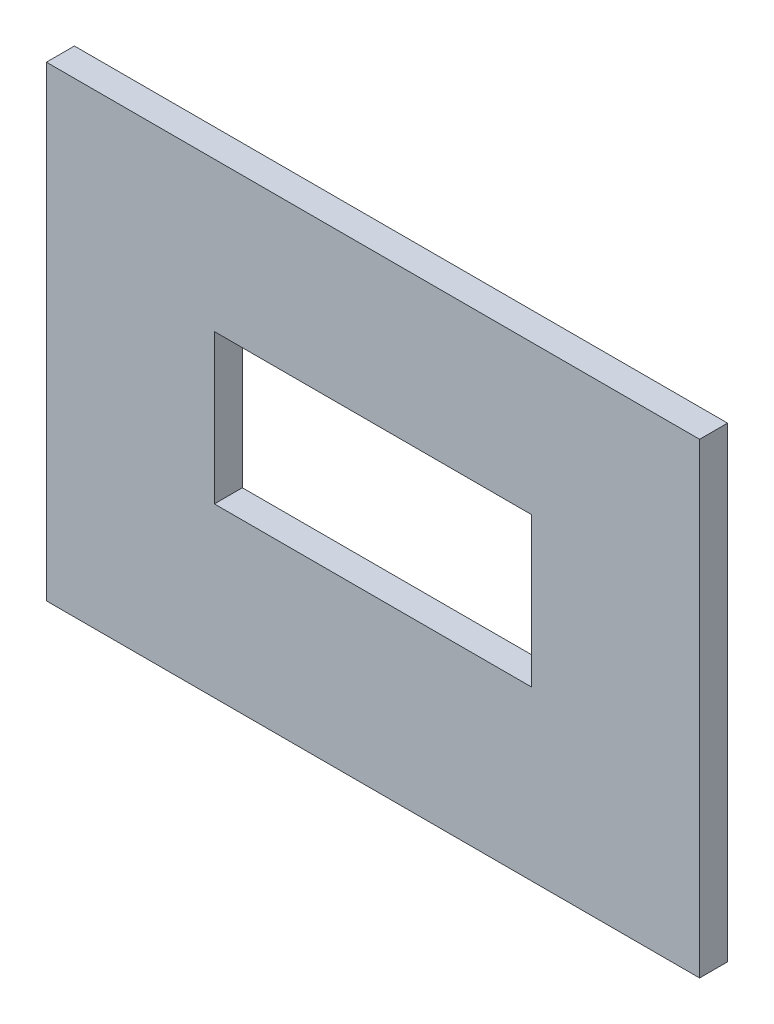
ISO-10303-21;
HEADER;
FILE_DESCRIPTION(('STEP AP214'),'2;1');
FILE_NAME('part.step','',(''),(''),'','','');
FILE_SCHEMA(('AUTOMOTIVE_DESIGN { 1 0 10303 214 1 1 1 1 }'));
ENDSEC;
DATA;
#1=APPLICATION_CONTEXT('core data for automotive mechanical design processes');
#2=APPLICATION_PROTOCOL_DEFINITION('international standard','automotive_design',2000,#1);
#3=PRODUCT_CONTEXT('',#1,'mechanical');
#4=PRODUCT('Part','Part','',(#3));
#5=PRODUCT_RELATED_PRODUCT_CATEGORY('part','',(#4));
#6=PRODUCT_DEFINITION_FORMATION('','',#4);
#7=PRODUCT_DEFINITION_CONTEXT('part definition',#1,'design');
#8=PRODUCT_DEFINITION('design','',#6,#7);
#9=PRODUCT_DEFINITION_SHAPE('','',#8);
#10=(LENGTH_UNIT() NAMED_UNIT(*) SI_UNIT(.MILLI.,.METRE.));
#11=(NAMED_UNIT(*) PLANE_ANGLE_UNIT() SI_UNIT($,.RADIAN.));
#12=(NAMED_UNIT(*) SI_UNIT($,.STERADIAN.) SOLID_ANGLE_UNIT());
#13=UNCERTAINTY_MEASURE_WITH_UNIT(LENGTH_MEASURE(1.E-05),#10,'distance_accuracy_value','');
#14=(GEOMETRIC_REPRESENTATION_CONTEXT(3) GLOBAL_UNCERTAINTY_ASSIGNED_CONTEXT((#13)) GLOBAL_UNIT_ASSIGNED_CONTEXT((#10,
#11,#12)) REPRESENTATION_CONTEXT('',''));
#15=CARTESIAN_POINT('',(0.,0.,0.));
#16=DIRECTION('',(0.,0.,1.));
#17=DIRECTION('',(1.,0.,0.));
#18=AXIS2_PLACEMENT_3D('',#15,#16,#17);
#19=CARTESIAN_POINT('',(0.,0.,3.));
#20=DIRECTION('',(0.,0.,-1.));
#21=DIRECTION('',(-1.,0.,0.));
#22=AXIS2_PLACEMENT_3D('',#19,#20,#21);
#23=PLANE('',#22);
#24=DIRECTION('',(1.,0.,0.));
#25=VECTOR('',#24,1.);
#26=CARTESIAN_POINT('',(16.,0.,3.));
#27=LINE('',#26,#25);
#28=CARTESIAN_POINT('',(0.,0.,3.));
#29=VERTEX_POINT('',#28);
#30=CARTESIAN_POINT('',(70.,0.,3.));
#31=VERTEX_POINT('',#30);
#32=EDGE_CURVE('E135',#29,#31,#27,.T.);
#33=ORIENTED_EDGE('',*,*,#32,.T.);
#34=DIRECTION('',(0.,1.,0.));
#35=VECTOR('',#34,1.);
#36=CARTESIAN_POINT('',(70.,50.,3.));
#37=LINE('',#36,#35);
#38=CARTESIAN_POINT('',(70.,50.,3.));
#39=VERTEX_POINT('',#38);
#40=EDGE_CURVE('E137',#31,#39,#37,.T.);
#41=ORIENTED_EDGE('',*,*,#40,.T.);
#42=DIRECTION('',(-1.,0.,0.));
#43=VECTOR('',#42,1.);
#44=CARTESIAN_POINT('',(0.,50.,3.));
#45=LINE('',#44,#43);
#46=CARTESIAN_POINT('',(0.,50.,3.));
#47=VERTEX_POINT('',#46);
#48=EDGE_CURVE('E140',#39,#47,#45,.T.);
#49=ORIENTED_EDGE('',*,*,#48,.T.);
#50=DIRECTION('',(0.,-1.,0.));
#51=VECTOR('',#50,1.);
#52=CARTESIAN_POINT('',(0.,0.,3.));
#53=LINE('',#52,#51);
#54=EDGE_CURVE('E142',#47,#29,#53,.T.);
#55=ORIENTED_EDGE('',*,*,#54,.T.);
#56=EDGE_LOOP('',(#33,#41,#49,#55));
#57=FACE_BOUND('',#56,.T.);
#58=DIRECTION('',(0.,-1.,0.));
#59=VECTOR('',#58,1.);
#60=CARTESIAN_POINT('',(18.,18.,3.));
#61=LINE('',#60,#59);
#62=CARTESIAN_POINT('',(18.,34.,3.));
#63=VERTEX_POINT('',#62);
#64=CARTESIAN_POINT('',(18.,18.,3.));
#65=VERTEX_POINT('',#64);
#66=EDGE_CURVE('E99',#63,#65,#61,.T.);
#67=ORIENTED_EDGE('',*,*,#66,.F.);
#68=DIRECTION('',(-1.,0.,0.));
#69=VECTOR('',#68,1.);
#70=CARTESIAN_POINT('',(52.,34.,3.));
#71=LINE('',#70,#69);
#72=CARTESIAN_POINT('',(52.,34.,3.));
#73=VERTEX_POINT('',#72);
#74=EDGE_CURVE('E121',#73,#63,#71,.T.);
#75=ORIENTED_EDGE('',*,*,#74,.F.);
#76=DIRECTION('',(0.,1.,0.));
#77=VECTOR('',#76,1.);
#78=CARTESIAN_POINT('',(52.,34.,3.));
#79=LINE('',#78,#77);
#80=CARTESIAN_POINT('',(52.,18.,3.));
#81=VERTEX_POINT('',#80);
#82=EDGE_CURVE('E119',#81,#73,#79,.T.);
#83=ORIENTED_EDGE('',*,*,#82,.F.);
#84=DIRECTION('',(1.,0.,0.));
#85=VECTOR('',#84,1.);
#86=CARTESIAN_POINT('',(18.,18.,3.));
#87=LINE('',#86,#85);
#88=EDGE_CURVE('E107',#65,#81,#87,.T.);
#89=ORIENTED_EDGE('',*,*,#88,.F.);
#90=EDGE_LOOP('',(#67,#75,#83,#89));
#91=FACE_BOUND('',#90,.T.);
#92=ADVANCED_FACE('F34',(#57,#91),#23,.F.);
#93=CARTESIAN_POINT('',(0.,0.,0.));
#94=DIRECTION('',(0.,0.,-1.));
#95=DIRECTION('',(-1.,0.,0.));
#96=AXIS2_PLACEMENT_3D('',#93,#94,#95);
#97=PLANE('',#96);
#98=DIRECTION('',(1.,0.,0.));
#99=VECTOR('',#98,1.);
#100=CARTESIAN_POINT('',(70.,0.,0.));
#101=LINE('',#100,#99);
#102=CARTESIAN_POINT('',(0.,0.,0.));
#103=VERTEX_POINT('',#102);
#104=CARTESIAN_POINT('',(70.,0.,0.));
#105=VERTEX_POINT('',#104);
#106=EDGE_CURVE('E115',#103,#105,#101,.T.);
#107=ORIENTED_EDGE('',*,*,#106,.F.);
#108=DIRECTION('',(0.,-1.,0.));
#109=VECTOR('',#108,1.);
#110=CARTESIAN_POINT('',(0.,0.,0.));
#111=LINE('',#110,#109);
#112=CARTESIAN_POINT('',(0.,50.,0.));
#113=VERTEX_POINT('',#112);
#114=EDGE_CURVE('E138',#113,#103,#111,.T.);
#115=ORIENTED_EDGE('',*,*,#114,.F.);
#116=DIRECTION('',(-1.,0.,0.));
#117=VECTOR('',#116,1.);
#118=CARTESIAN_POINT('',(0.,50.,0.));
#119=LINE('',#118,#117);
#120=CARTESIAN_POINT('',(70.,50.,0.));
#121=VERTEX_POINT('',#120);
#122=EDGE_CURVE('E148',#121,#113,#119,.T.);
#123=ORIENTED_EDGE('',*,*,#122,.F.);
#124=DIRECTION('',(0.,1.,0.));
#125=VECTOR('',#124,1.);
#126=CARTESIAN_POINT('',(70.,50.,0.));
#127=LINE('',#126,#125);
#128=EDGE_CURVE('E146',#105,#121,#127,.T.);
#129=ORIENTED_EDGE('',*,*,#128,.F.);
#130=EDGE_LOOP('',(#107,#115,#123,#129));
#131=FACE_BOUND('',#130,.T.);
#132=DIRECTION('',(-1.,0.,0.));
#133=VECTOR('',#132,1.);
#134=CARTESIAN_POINT('',(52.,34.,0.));
#135=LINE('',#134,#133);
#136=CARTESIAN_POINT('',(52.,34.,0.));
#137=VERTEX_POINT('',#136);
#138=CARTESIAN_POINT('',(18.,34.,0.));
#139=VERTEX_POINT('',#138);
#140=EDGE_CURVE('E108',#137,#139,#135,.T.);
#141=ORIENTED_EDGE('',*,*,#140,.T.);
#142=DIRECTION('',(0.,-1.,0.));
#143=VECTOR('',#142,1.);
#144=CARTESIAN_POINT('',(18.,18.,0.));
#145=LINE('',#144,#143);
#146=CARTESIAN_POINT('',(18.,18.,0.));
#147=VERTEX_POINT('',#146);
#148=EDGE_CURVE('E57',#139,#147,#145,.T.);
#149=ORIENTED_EDGE('',*,*,#148,.T.);
#150=DIRECTION('',(1.,0.,0.));
#151=VECTOR('',#150,1.);
#152=CARTESIAN_POINT('',(18.,18.,0.));
#153=LINE('',#152,#151);
#154=CARTESIAN_POINT('',(52.,18.,0.));
#155=VERTEX_POINT('',#154);
#156=EDGE_CURVE('E114',#147,#155,#153,.T.);
#157=ORIENTED_EDGE('',*,*,#156,.T.);
#158=DIRECTION('',(0.,1.,0.));
#159=VECTOR('',#158,1.);
#160=CARTESIAN_POINT('',(52.,34.,0.));
#161=LINE('',#160,#159);
#162=EDGE_CURVE('E127',#155,#137,#161,.T.);
#163=ORIENTED_EDGE('',*,*,#162,.T.);
#164=EDGE_LOOP('',(#141,#149,#157,#163));
#165=FACE_BOUND('',#164,.T.);
#166=ADVANCED_FACE('F168',(#131,#165),#97,.T.);
#167=CARTESIAN_POINT('',(70.,0.,3.));
#168=DIRECTION('',(0.,1.,0.));
#169=DIRECTION('',(-1.,0.,0.));
#170=AXIS2_PLACEMENT_3D('',#167,#168,#169);
#171=PLANE('',#170);
#172=ORIENTED_EDGE('',*,*,#106,.T.);
#173=DIRECTION('',(0.,0.,-1.));
#174=VECTOR('',#173,1.);
#175=CARTESIAN_POINT('',(70.,0.,3.));
#176=LINE('',#175,#174);
#177=EDGE_CURVE('E11',#31,#105,#176,.T.);
#178=ORIENTED_EDGE('',*,*,#177,.F.);
#179=ORIENTED_EDGE('',*,*,#32,.F.);
#180=DIRECTION('',(0.,0.,-1.));
#181=VECTOR('',#180,1.);
#182=CARTESIAN_POINT('',(0.,0.,3.));
#183=LINE('',#182,#181);
#184=EDGE_CURVE('E144',#29,#103,#183,.T.);
#185=ORIENTED_EDGE('',*,*,#184,.T.);
#186=EDGE_LOOP('',(#172,#178,#179,#185));
#187=FACE_BOUND('',#186,.T.);
#188=ADVANCED_FACE('F36',(#187),#171,.F.);
#189=CARTESIAN_POINT('',(70.,50.,3.));
#190=DIRECTION('',(-1.,0.,0.));
#191=DIRECTION('',(0.,0.,1.));
#192=AXIS2_PLACEMENT_3D('',#189,#190,#191);
#193=PLANE('',#192);
#194=ORIENTED_EDGE('',*,*,#128,.T.);
#195=DIRECTION('',(0.,0.,-1.));
#196=VECTOR('',#195,1.);
#197=CARTESIAN_POINT('',(70.,50.,3.));
#198=LINE('',#197,#196);
#199=EDGE_CURVE('E42',#39,#121,#198,.T.);
#200=ORIENTED_EDGE('',*,*,#199,.F.);
#201=ORIENTED_EDGE('',*,*,#40,.F.);
#202=ORIENTED_EDGE('',*,*,#177,.T.);
#203=EDGE_LOOP('',(#194,#200,#201,#202));
#204=FACE_BOUND('',#203,.T.);
#205=ADVANCED_FACE('F178',(#204),#193,.F.);
#206=CARTESIAN_POINT('',(0.,50.,3.));
#207=DIRECTION('',(0.,-1.,0.));
#208=DIRECTION('',(1.,0.,0.));
#209=AXIS2_PLACEMENT_3D('',#206,#207,#208);
#210=PLANE('',#209);
#211=ORIENTED_EDGE('',*,*,#122,.T.);
#212=DIRECTION('',(0.,0.,-1.));
#213=VECTOR('',#212,1.);
#214=CARTESIAN_POINT('',(0.,50.,3.));
#215=LINE('',#214,#213);
#216=EDGE_CURVE('E154',#47,#113,#215,.T.);
#217=ORIENTED_EDGE('',*,*,#216,.F.);
#218=ORIENTED_EDGE('',*,*,#48,.F.);
#219=ORIENTED_EDGE('',*,*,#199,.T.);
#220=EDGE_LOOP('',(#211,#217,#218,#219));
#221=FACE_BOUND('',#220,.T.);
#222=ADVANCED_FACE('F161',(#221),#210,.F.);
#223=CARTESIAN_POINT('',(0.,0.,3.));
#224=DIRECTION('',(1.,0.,0.));
#225=DIRECTION('',(0.,1.,0.));
#226=AXIS2_PLACEMENT_3D('',#223,#224,#225);
#227=PLANE('',#226);
#228=ORIENTED_EDGE('',*,*,#114,.T.);
#229=ORIENTED_EDGE('',*,*,#184,.F.);
#230=ORIENTED_EDGE('',*,*,#54,.F.);
#231=ORIENTED_EDGE('',*,*,#216,.T.);
#232=EDGE_LOOP('',(#228,#229,#230,#231));
#233=FACE_BOUND('',#232,.T.);
#234=ADVANCED_FACE('F172',(#233),#227,.F.);
#235=CARTESIAN_POINT('',(18.,18.,3.));
#236=DIRECTION('',(1.,0.,0.));
#237=DIRECTION('',(0.,0.,-1.));
#238=AXIS2_PLACEMENT_3D('',#235,#236,#237);
#239=PLANE('',#238);
#240=ORIENTED_EDGE('',*,*,#148,.F.);
#241=DIRECTION('',(0.,0.,-1.));
#242=VECTOR('',#241,1.);
#243=CARTESIAN_POINT('',(18.,34.,3.));
#244=LINE('',#243,#242);
#245=EDGE_CURVE('E103',#63,#139,#244,.T.);
#246=ORIENTED_EDGE('',*,*,#245,.F.);
#247=ORIENTED_EDGE('',*,*,#66,.T.);
#248=DIRECTION('',(0.,0.,-1.));
#249=VECTOR('',#248,1.);
#250=CARTESIAN_POINT('',(18.,18.,3.));
#251=LINE('',#250,#249);
#252=EDGE_CURVE('E102',#65,#147,#251,.T.);
#253=ORIENTED_EDGE('',*,*,#252,.T.);
#254=EDGE_LOOP('',(#240,#246,#247,#253));
#255=FACE_BOUND('',#254,.T.);
#256=ADVANCED_FACE('F101',(#255),#239,.T.);
#257=CARTESIAN_POINT('',(18.,18.,3.));
#258=DIRECTION('',(0.,1.,0.));
#259=DIRECTION('',(0.,0.,1.));
#260=AXIS2_PLACEMENT_3D('',#257,#258,#259);
#261=PLANE('',#260);
#262=ORIENTED_EDGE('',*,*,#156,.F.);
#263=ORIENTED_EDGE('',*,*,#252,.F.);
#264=ORIENTED_EDGE('',*,*,#88,.T.);
#265=DIRECTION('',(0.,0.,-1.));
#266=VECTOR('',#265,1.);
#267=CARTESIAN_POINT('',(52.,18.,3.));
#268=LINE('',#267,#266);
#269=EDGE_CURVE('E116',#81,#155,#268,.T.);
#270=ORIENTED_EDGE('',*,*,#269,.T.);
#271=EDGE_LOOP('',(#262,#263,#264,#270));
#272=FACE_BOUND('',#271,.T.);
#273=ADVANCED_FACE('F111',(#272),#261,.T.);
#274=CARTESIAN_POINT('',(52.,34.,3.));
#275=DIRECTION('',(-1.,0.,0.));
#276=DIRECTION('',(0.,0.,1.));
#277=AXIS2_PLACEMENT_3D('',#274,#275,#276);
#278=PLANE('',#277);
#279=ORIENTED_EDGE('',*,*,#162,.F.);
#280=ORIENTED_EDGE('',*,*,#269,.F.);
#281=ORIENTED_EDGE('',*,*,#82,.T.);
#282=DIRECTION('',(0.,0.,-1.));
#283=VECTOR('',#282,1.);
#284=CARTESIAN_POINT('',(52.,34.,3.));
#285=LINE('',#284,#283);
#286=EDGE_CURVE('E49',#73,#137,#285,.T.);
#287=ORIENTED_EDGE('',*,*,#286,.T.);
#288=EDGE_LOOP('',(#279,#280,#281,#287));
#289=FACE_BOUND('',#288,.T.);
#290=ADVANCED_FACE('F201',(#289),#278,.T.);
#291=CARTESIAN_POINT('',(52.,34.,3.));
#292=DIRECTION('',(0.,-1.,0.));
#293=DIRECTION('',(0.,0.,-1.));
#294=AXIS2_PLACEMENT_3D('',#291,#292,#293);
#295=PLANE('',#294);
#296=ORIENTED_EDGE('',*,*,#140,.F.);
#297=ORIENTED_EDGE('',*,*,#286,.F.);
#298=ORIENTED_EDGE('',*,*,#74,.T.);
#299=ORIENTED_EDGE('',*,*,#245,.T.);
#300=EDGE_LOOP('',(#296,#297,#298,#299));
#301=FACE_BOUND('',#300,.T.);
#302=ADVANCED_FACE('F205',(#301),#295,.T.);
#303=CLOSED_SHELL('',(#92,#166,#188,#205,#222,#234,#256,#273,#290,#302));
#304=MANIFOLD_SOLID_BREP('B2',#303);
#305=ADVANCED_BREP_SHAPE_REPRESENTATION('',(#18,#304),#14);
#306=SHAPE_DEFINITION_REPRESENTATION(#9,#305);
ENDSEC;
END-ISO-10303-21;
